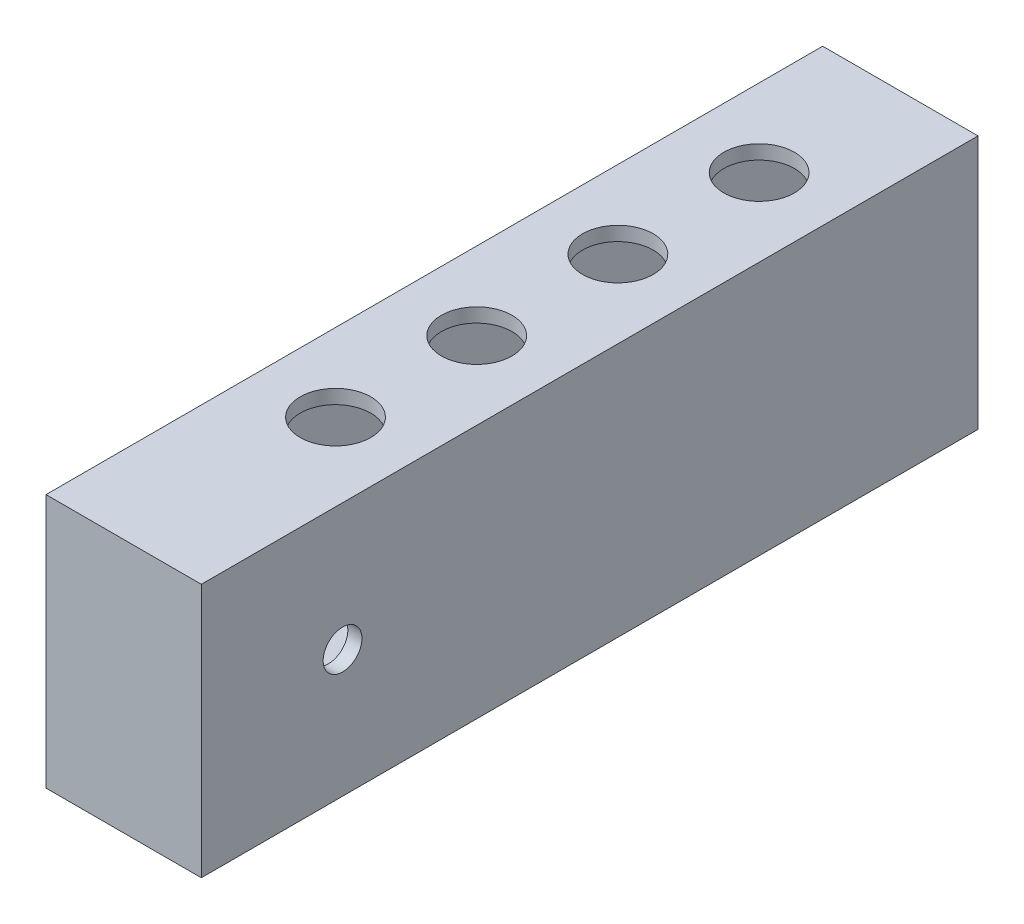
ISO-10303-21;
HEADER;
FILE_DESCRIPTION(('STEP AP214'),'2;1');
FILE_NAME('part.step','',(''),(''),'','','');
FILE_SCHEMA(('AUTOMOTIVE_DESIGN { 1 0 10303 214 1 1 1 1 }'));
ENDSEC;
DATA;
#1=APPLICATION_CONTEXT('core data for automotive mechanical design processes');
#2=APPLICATION_PROTOCOL_DEFINITION('international standard','automotive_design',2000,#1);
#3=PRODUCT_CONTEXT('',#1,'mechanical');
#4=PRODUCT('Part','Part','',(#3));
#5=PRODUCT_RELATED_PRODUCT_CATEGORY('part','',(#4));
#6=PRODUCT_DEFINITION_FORMATION('','',#4);
#7=PRODUCT_DEFINITION_CONTEXT('part definition',#1,'design');
#8=PRODUCT_DEFINITION('design','',#6,#7);
#9=PRODUCT_DEFINITION_SHAPE('','',#8);
#10=(LENGTH_UNIT() NAMED_UNIT(*) SI_UNIT(.MILLI.,.METRE.));
#11=(NAMED_UNIT(*) PLANE_ANGLE_UNIT() SI_UNIT($,.RADIAN.));
#12=(NAMED_UNIT(*) SI_UNIT($,.STERADIAN.) SOLID_ANGLE_UNIT());
#13=UNCERTAINTY_MEASURE_WITH_UNIT(LENGTH_MEASURE(1.E-05),#10,'distance_accuracy_value','');
#14=(GEOMETRIC_REPRESENTATION_CONTEXT(3) GLOBAL_UNCERTAINTY_ASSIGNED_CONTEXT((#13)) GLOBAL_UNIT_ASSIGNED_CONTEXT((#10,
#11,#12)) REPRESENTATION_CONTEXT('',''));
#15=CARTESIAN_POINT('',(0.,0.,0.));
#16=DIRECTION('',(0.,0.,1.));
#17=DIRECTION('',(1.,0.,0.));
#18=AXIS2_PLACEMENT_3D('',#15,#16,#17);
#19=CARTESIAN_POINT('',(0.,0.,110.));
#20=DIRECTION('',(0.,1.,0.));
#21=DIRECTION('',(0.,0.,1.));
#22=AXIS2_PLACEMENT_3D('',#19,#20,#21);
#23=PLANE('',#22);
#24=CARTESIAN_POINT('',(0.,0.,20.));
#25=DIRECTION('',(0.,-1.,0.));
#26=DIRECTION('',(0.,0.,-1.));
#27=AXIS2_PLACEMENT_3D('',#24,#25,#26);
#28=CIRCLE('',#27,5.);
#29=CARTESIAN_POINT('',(0.,0.,15.));
#30=VERTEX_POINT('',#29);
#31=EDGE_CURVE('E323',#30,#30,#28,.T.);
#32=ORIENTED_EDGE('',*,*,#31,.F.);
#33=EDGE_LOOP('',(#32));
#34=FACE_BOUND('',#33,.T.);
#35=CARTESIAN_POINT('',(-6.27241994192617E-13,0.,80.));
#36=DIRECTION('',(0.,-1.,0.));
#37=DIRECTION('',(0.,0.,-1.));
#38=AXIS2_PLACEMENT_3D('',#35,#36,#37);
#39=CIRCLE('',#38,5.);
#40=CARTESIAN_POINT('',(-6.27241994192617E-13,0.,75.));
#41=VERTEX_POINT('',#40);
#42=EDGE_CURVE('E325',#41,#41,#39,.T.);
#43=ORIENTED_EDGE('',*,*,#42,.F.);
#44=EDGE_LOOP('',(#43));
#45=FACE_BOUND('',#44,.T.);
#46=CARTESIAN_POINT('',(-4.18977760661176E-13,0.,60.));
#47=DIRECTION('',(0.,-1.,0.));
#48=DIRECTION('',(0.,0.,-1.));
#49=AXIS2_PLACEMENT_3D('',#46,#47,#48);
#50=CIRCLE('',#49,5.);
#51=CARTESIAN_POINT('',(-4.18977760661176E-13,0.,55.));
#52=VERTEX_POINT('',#51);
#53=EDGE_CURVE('E329',#52,#52,#50,.T.);
#54=ORIENTED_EDGE('',*,*,#53,.F.);
#55=EDGE_LOOP('',(#54));
#56=FACE_BOUND('',#55,.T.);
#57=CARTESIAN_POINT('',(-2.10713527129735E-13,0.,40.));
#58=DIRECTION('',(0.,-1.,0.));
#59=DIRECTION('',(0.,0.,-1.));
#60=AXIS2_PLACEMENT_3D('',#57,#58,#59);
#61=CIRCLE('',#60,5.);
#62=CARTESIAN_POINT('',(-2.10713527129735E-13,0.,35.));
#63=VERTEX_POINT('',#62);
#64=EDGE_CURVE('E204',#63,#63,#61,.T.);
#65=ORIENTED_EDGE('',*,*,#64,.F.);
#66=EDGE_LOOP('',(#65));
#67=FACE_BOUND('',#66,.T.);
#68=DIRECTION('',(1.,0.,0.));
#69=VECTOR('',#68,1.);
#70=CARTESIAN_POINT('',(0.,0.,0.));
#71=LINE('',#70,#69);
#72=CARTESIAN_POINT('',(-11.,0.,0.));
#73=VERTEX_POINT('',#72);
#74=CARTESIAN_POINT('',(11.,0.,0.));
#75=VERTEX_POINT('',#74);
#76=EDGE_CURVE('E167',#73,#75,#71,.T.);
#77=ORIENTED_EDGE('',*,*,#76,.T.);
#78=DIRECTION('',(0.,0.,-1.));
#79=VECTOR('',#78,1.);
#80=CARTESIAN_POINT('',(11.,0.,110.));
#81=LINE('',#80,#79);
#82=CARTESIAN_POINT('',(11.,0.,110.));
#83=VERTEX_POINT('',#82);
#84=EDGE_CURVE('E73',#83,#75,#81,.T.);
#85=ORIENTED_EDGE('',*,*,#84,.F.);
#86=DIRECTION('',(1.,0.,0.));
#87=VECTOR('',#86,1.);
#88=CARTESIAN_POINT('',(0.,0.,110.));
#89=LINE('',#88,#87);
#90=CARTESIAN_POINT('',(-11.,0.,110.));
#91=VERTEX_POINT('',#90);
#92=EDGE_CURVE('E118',#91,#83,#89,.T.);
#93=ORIENTED_EDGE('',*,*,#92,.F.);
#94=DIRECTION('',(0.,0.,-1.));
#95=VECTOR('',#94,1.);
#96=CARTESIAN_POINT('',(-11.,0.,110.));
#97=LINE('',#96,#95);
#98=EDGE_CURVE('E12',#91,#73,#97,.T.);
#99=ORIENTED_EDGE('',*,*,#98,.T.);
#100=EDGE_LOOP('',(#77,#85,#93,#99));
#101=FACE_BOUND('',#100,.T.);
#102=ADVANCED_FACE('F64',(#34,#45,#56,#67,#101),#23,.F.);
#103=CARTESIAN_POINT('',(11.,0.,110.));
#104=DIRECTION('',(-1.,0.,0.));
#105=DIRECTION('',(0.,-1.,0.));
#106=AXIS2_PLACEMENT_3D('',#103,#104,#105);
#107=PLANE('',#106);
#108=CARTESIAN_POINT('',(11.,18.,90.));
#109=DIRECTION('',(1.,0.,0.));
#110=DIRECTION('',(0.,1.,0.));
#111=AXIS2_PLACEMENT_3D('',#108,#109,#110);
#112=CIRCLE('',#111,2.75000000000001);
#113=CARTESIAN_POINT('',(11.,20.75,90.));
#114=VERTEX_POINT('',#113);
#115=EDGE_CURVE('E339',#114,#114,#112,.T.);
#116=ORIENTED_EDGE('',*,*,#115,.F.);
#117=EDGE_LOOP('',(#116));
#118=FACE_BOUND('',#117,.T.);
#119=DIRECTION('',(0.,1.,0.));
#120=VECTOR('',#119,1.);
#121=CARTESIAN_POINT('',(11.,0.,0.));
#122=LINE('',#121,#120);
#123=CARTESIAN_POINT('',(11.,36.,0.));
#124=VERTEX_POINT('',#123);
#125=EDGE_CURVE('E192',#75,#124,#122,.T.);
#126=ORIENTED_EDGE('',*,*,#125,.T.);
#127=DIRECTION('',(0.,0.,-1.));
#128=VECTOR('',#127,1.);
#129=CARTESIAN_POINT('',(11.,36.,110.));
#130=LINE('',#129,#128);
#131=CARTESIAN_POINT('',(11.,36.,110.));
#132=VERTEX_POINT('',#131);
#133=EDGE_CURVE('E196',#132,#124,#130,.T.);
#134=ORIENTED_EDGE('',*,*,#133,.F.);
#135=DIRECTION('',(0.,1.,0.));
#136=VECTOR('',#135,1.);
#137=CARTESIAN_POINT('',(11.,0.,110.));
#138=LINE('',#137,#136);
#139=EDGE_CURVE('E187',#83,#132,#138,.T.);
#140=ORIENTED_EDGE('',*,*,#139,.F.);
#141=ORIENTED_EDGE('',*,*,#84,.T.);
#142=EDGE_LOOP('',(#126,#134,#140,#141));
#143=FACE_BOUND('',#142,.T.);
#144=ADVANCED_FACE('F258',(#118,#143),#107,.F.);
#145=CARTESIAN_POINT('',(0.,36.,110.));
#146=DIRECTION('',(0.,-1.,0.));
#147=DIRECTION('',(0.,0.,-1.));
#148=AXIS2_PLACEMENT_3D('',#145,#146,#147);
#149=PLANE('',#148);
#150=CARTESIAN_POINT('',(0.,36.,20.));
#151=DIRECTION('',(0.,-1.,0.));
#152=DIRECTION('',(0.,0.,-1.));
#153=AXIS2_PLACEMENT_3D('',#150,#151,#152);
#154=CIRCLE('',#153,5.);
#155=CARTESIAN_POINT('',(0.,36.,15.));
#156=VERTEX_POINT('',#155);
#157=EDGE_CURVE('E180',#156,#156,#154,.T.);
#158=ORIENTED_EDGE('',*,*,#157,.T.);
#159=EDGE_LOOP('',(#158));
#160=FACE_BOUND('',#159,.T.);
#161=CARTESIAN_POINT('',(-6.27241994192617E-13,36.,80.));
#162=DIRECTION('',(0.,-1.,0.));
#163=DIRECTION('',(0.,0.,-1.));
#164=AXIS2_PLACEMENT_3D('',#161,#162,#163);
#165=CIRCLE('',#164,5.);
#166=CARTESIAN_POINT('',(-6.27241994192617E-13,36.,75.));
#167=VERTEX_POINT('',#166);
#168=EDGE_CURVE('E217',#167,#167,#165,.T.);
#169=ORIENTED_EDGE('',*,*,#168,.T.);
#170=EDGE_LOOP('',(#169));
#171=FACE_BOUND('',#170,.T.);
#172=CARTESIAN_POINT('',(-4.18977760661176E-13,36.,60.));
#173=DIRECTION('',(0.,-1.,0.));
#174=DIRECTION('',(0.,0.,-1.));
#175=AXIS2_PLACEMENT_3D('',#172,#173,#174);
#176=CIRCLE('',#175,5.);
#177=CARTESIAN_POINT('',(-4.18977760661176E-13,36.,55.));
#178=VERTEX_POINT('',#177);
#179=EDGE_CURVE('E213',#178,#178,#176,.T.);
#180=ORIENTED_EDGE('',*,*,#179,.T.);
#181=EDGE_LOOP('',(#180));
#182=FACE_BOUND('',#181,.T.);
#183=CARTESIAN_POINT('',(-2.10713527129735E-13,36.,40.));
#184=DIRECTION('',(0.,-1.,0.));
#185=DIRECTION('',(0.,0.,-1.));
#186=AXIS2_PLACEMENT_3D('',#183,#184,#185);
#187=CIRCLE('',#186,5.);
#188=CARTESIAN_POINT('',(-2.10713527129735E-13,36.,35.));
#189=VERTEX_POINT('',#188);
#190=EDGE_CURVE('E209',#189,#189,#187,.T.);
#191=ORIENTED_EDGE('',*,*,#190,.T.);
#192=EDGE_LOOP('',(#191));
#193=FACE_BOUND('',#192,.T.);
#194=DIRECTION('',(-1.,0.,0.));
#195=VECTOR('',#194,1.);
#196=CARTESIAN_POINT('',(0.,36.,0.));
#197=LINE('',#196,#195);
#198=CARTESIAN_POINT('',(-11.,36.,0.));
#199=VERTEX_POINT('',#198);
#200=EDGE_CURVE('E111',#124,#199,#197,.T.);
#201=ORIENTED_EDGE('',*,*,#200,.T.);
#202=DIRECTION('',(0.,0.,-1.));
#203=VECTOR('',#202,1.);
#204=CARTESIAN_POINT('',(-11.,36.,110.));
#205=LINE('',#204,#203);
#206=CARTESIAN_POINT('',(-11.,36.,110.));
#207=VERTEX_POINT('',#206);
#208=EDGE_CURVE('E189',#207,#199,#205,.T.);
#209=ORIENTED_EDGE('',*,*,#208,.F.);
#210=DIRECTION('',(-1.,0.,0.));
#211=VECTOR('',#210,1.);
#212=CARTESIAN_POINT('',(0.,36.,110.));
#213=LINE('',#212,#211);
#214=EDGE_CURVE('E90',#132,#207,#213,.T.);
#215=ORIENTED_EDGE('',*,*,#214,.F.);
#216=ORIENTED_EDGE('',*,*,#133,.T.);
#217=EDGE_LOOP('',(#201,#209,#215,#216));
#218=FACE_BOUND('',#217,.T.);
#219=ADVANCED_FACE('F233',(#160,#171,#182,#193,#218),#149,.F.);
#220=CARTESIAN_POINT('',(-11.,0.,110.));
#221=DIRECTION('',(1.,0.,0.));
#222=DIRECTION('',(0.,1.,0.));
#223=AXIS2_PLACEMENT_3D('',#220,#221,#222);
#224=PLANE('',#223);
#225=CARTESIAN_POINT('',(-11.,18.,90.));
#226=DIRECTION('',(1.,0.,0.));
#227=DIRECTION('',(0.,1.,0.));
#228=AXIS2_PLACEMENT_3D('',#225,#226,#227);
#229=CIRCLE('',#228,2.75000000000001);
#230=CARTESIAN_POINT('',(-11.,20.75,90.));
#231=VERTEX_POINT('',#230);
#232=EDGE_CURVE('E333',#231,#231,#229,.T.);
#233=ORIENTED_EDGE('',*,*,#232,.T.);
#234=EDGE_LOOP('',(#233));
#235=FACE_BOUND('',#234,.T.);
#236=DIRECTION('',(0.,-1.,0.));
#237=VECTOR('',#236,1.);
#238=CARTESIAN_POINT('',(-11.,0.,0.));
#239=LINE('',#238,#237);
#240=EDGE_CURVE('E163',#199,#73,#239,.T.);
#241=ORIENTED_EDGE('',*,*,#240,.T.);
#242=ORIENTED_EDGE('',*,*,#98,.F.);
#243=DIRECTION('',(0.,-1.,0.));
#244=VECTOR('',#243,1.);
#245=CARTESIAN_POINT('',(-11.,0.,110.));
#246=LINE('',#245,#244);
#247=EDGE_CURVE('E184',#207,#91,#246,.T.);
#248=ORIENTED_EDGE('',*,*,#247,.F.);
#249=ORIENTED_EDGE('',*,*,#208,.T.);
#250=EDGE_LOOP('',(#241,#242,#248,#249));
#251=FACE_BOUND('',#250,.T.);
#252=ADVANCED_FACE('F66',(#235,#251),#224,.F.);
#253=CARTESIAN_POINT('',(0.,0.,0.));
#254=DIRECTION('',(0.,0.,1.));
#255=DIRECTION('',(1.,0.,0.));
#256=AXIS2_PLACEMENT_3D('',#253,#254,#255);
#257=PLANE('',#256);
#258=DIRECTION('',(-1.,0.,0.));
#259=VECTOR('',#258,1.);
#260=CARTESIAN_POINT('',(0.,34.,0.));
#261=LINE('',#260,#259);
#262=CARTESIAN_POINT('',(9.,34.,0.));
#263=VERTEX_POINT('',#262);
#264=CARTESIAN_POINT('',(-9.,34.,0.));
#265=VERTEX_POINT('',#264);
#266=EDGE_CURVE('E158',#263,#265,#261,.T.);
#267=ORIENTED_EDGE('',*,*,#266,.T.);
#268=DIRECTION('',(0.,-1.,0.));
#269=VECTOR('',#268,1.);
#270=CARTESIAN_POINT('',(-9.,0.,0.));
#271=LINE('',#270,#269);
#272=CARTESIAN_POINT('',(-9.,2.,0.));
#273=VERTEX_POINT('',#272);
#274=EDGE_CURVE('E178',#265,#273,#271,.T.);
#275=ORIENTED_EDGE('',*,*,#274,.T.);
#276=DIRECTION('',(1.,0.,0.));
#277=VECTOR('',#276,1.);
#278=CARTESIAN_POINT('',(0.,2.,0.));
#279=LINE('',#278,#277);
#280=CARTESIAN_POINT('',(9.,2.,0.));
#281=VERTEX_POINT('',#280);
#282=EDGE_CURVE('E162',#273,#281,#279,.T.);
#283=ORIENTED_EDGE('',*,*,#282,.T.);
#284=DIRECTION('',(0.,1.,0.));
#285=VECTOR('',#284,1.);
#286=CARTESIAN_POINT('',(9.,0.,0.));
#287=LINE('',#286,#285);
#288=EDGE_CURVE('E81',#281,#263,#287,.T.);
#289=ORIENTED_EDGE('',*,*,#288,.T.);
#290=EDGE_LOOP('',(#267,#275,#283,#289));
#291=FACE_BOUND('',#290,.T.);
#292=ORIENTED_EDGE('',*,*,#240,.F.);
#293=ORIENTED_EDGE('',*,*,#200,.F.);
#294=ORIENTED_EDGE('',*,*,#125,.F.);
#295=ORIENTED_EDGE('',*,*,#76,.F.);
#296=EDGE_LOOP('',(#292,#293,#294,#295));
#297=FACE_BOUND('',#296,.T.);
#298=ADVANCED_FACE('F270',(#291,#297),#257,.F.);
#299=CARTESIAN_POINT('',(0.,0.,110.));
#300=DIRECTION('',(0.,0.,1.));
#301=DIRECTION('',(1.,0.,0.));
#302=AXIS2_PLACEMENT_3D('',#299,#300,#301);
#303=PLANE('',#302);
#304=ORIENTED_EDGE('',*,*,#247,.T.);
#305=ORIENTED_EDGE('',*,*,#92,.T.);
#306=ORIENTED_EDGE('',*,*,#139,.T.);
#307=ORIENTED_EDGE('',*,*,#214,.T.);
#308=EDGE_LOOP('',(#304,#305,#306,#307));
#309=FACE_BOUND('',#308,.T.);
#310=ADVANCED_FACE('F273',(#309),#303,.T.);
#311=CARTESIAN_POINT('',(0.,2.,110.));
#312=DIRECTION('',(0.,1.,0.));
#313=DIRECTION('',(0.,0.,1.));
#314=AXIS2_PLACEMENT_3D('',#311,#312,#313);
#315=PLANE('',#314);
#316=CARTESIAN_POINT('',(0.,2.,20.));
#317=DIRECTION('',(0.,1.,0.));
#318=DIRECTION('',(0.,0.,1.));
#319=AXIS2_PLACEMENT_3D('',#316,#317,#318);
#320=CIRCLE('',#319,5.);
#321=CARTESIAN_POINT('',(0.,2.,25.));
#322=VERTEX_POINT('',#321);
#323=EDGE_CURVE('E216',#322,#322,#320,.T.);
#324=ORIENTED_EDGE('',*,*,#323,.F.);
#325=EDGE_LOOP('',(#324));
#326=FACE_BOUND('',#325,.T.);
#327=CARTESIAN_POINT('',(-6.27241994192617E-13,2.,80.));
#328=DIRECTION('',(0.,1.,0.));
#329=DIRECTION('',(0.,0.,1.));
#330=AXIS2_PLACEMENT_3D('',#327,#328,#329);
#331=CIRCLE('',#330,5.);
#332=CARTESIAN_POINT('',(-6.27241994192617E-13,2.,85.));
#333=VERTEX_POINT('',#332);
#334=EDGE_CURVE('E212',#333,#333,#331,.T.);
#335=ORIENTED_EDGE('',*,*,#334,.F.);
#336=EDGE_LOOP('',(#335));
#337=FACE_BOUND('',#336,.T.);
#338=CARTESIAN_POINT('',(-4.18977760661176E-13,2.,60.));
#339=DIRECTION('',(0.,1.,0.));
#340=DIRECTION('',(0.,0.,1.));
#341=AXIS2_PLACEMENT_3D('',#338,#339,#340);
#342=CIRCLE('',#341,5.);
#343=CARTESIAN_POINT('',(-4.18977760661176E-13,2.,65.));
#344=VERTEX_POINT('',#343);
#345=EDGE_CURVE('E208',#344,#344,#342,.T.);
#346=ORIENTED_EDGE('',*,*,#345,.F.);
#347=EDGE_LOOP('',(#346));
#348=FACE_BOUND('',#347,.T.);
#349=CARTESIAN_POINT('',(-2.10713527129735E-13,2.,40.));
#350=DIRECTION('',(0.,1.,0.));
#351=DIRECTION('',(0.,0.,1.));
#352=AXIS2_PLACEMENT_3D('',#349,#350,#351);
#353=CIRCLE('',#352,5.);
#354=CARTESIAN_POINT('',(-2.10713527129735E-13,2.,45.));
#355=VERTEX_POINT('',#354);
#356=EDGE_CURVE('E203',#355,#355,#353,.T.);
#357=ORIENTED_EDGE('',*,*,#356,.F.);
#358=EDGE_LOOP('',(#357));
#359=FACE_BOUND('',#358,.T.);
#360=ORIENTED_EDGE('',*,*,#282,.F.);
#361=DIRECTION('',(0.,0.,-1.));
#362=VECTOR('',#361,1.);
#363=CARTESIAN_POINT('',(-9.,2.,110.));
#364=LINE('',#363,#362);
#365=CARTESIAN_POINT('',(-9.,2.,108.));
#366=VERTEX_POINT('',#365);
#367=EDGE_CURVE('E155',#366,#273,#364,.T.);
#368=ORIENTED_EDGE('',*,*,#367,.F.);
#369=DIRECTION('',(1.,0.,0.));
#370=VECTOR('',#369,1.);
#371=CARTESIAN_POINT('',(0.,2.,108.));
#372=LINE('',#371,#370);
#373=CARTESIAN_POINT('',(9.,2.,108.));
#374=VERTEX_POINT('',#373);
#375=EDGE_CURVE('E141',#366,#374,#372,.T.);
#376=ORIENTED_EDGE('',*,*,#375,.T.);
#377=DIRECTION('',(0.,0.,-1.));
#378=VECTOR('',#377,1.);
#379=CARTESIAN_POINT('',(9.,2.,110.));
#380=LINE('',#379,#378);
#381=EDGE_CURVE('E164',#374,#281,#380,.T.);
#382=ORIENTED_EDGE('',*,*,#381,.T.);
#383=EDGE_LOOP('',(#360,#368,#376,#382));
#384=FACE_BOUND('',#383,.T.);
#385=ADVANCED_FACE('F160',(#326,#337,#348,#359,#384),#315,.T.);
#386=CARTESIAN_POINT('',(9.,0.,110.));
#387=DIRECTION('',(-1.,0.,0.));
#388=DIRECTION('',(0.,-1.,0.));
#389=AXIS2_PLACEMENT_3D('',#386,#387,#388);
#390=PLANE('',#389);
#391=CARTESIAN_POINT('',(9.,18.,90.));
#392=DIRECTION('',(-1.,0.,0.));
#393=DIRECTION('',(0.,-1.,0.));
#394=AXIS2_PLACEMENT_3D('',#391,#392,#393);
#395=CIRCLE('',#394,2.75000000000001);
#396=CARTESIAN_POINT('',(9.,15.25,90.));
#397=VERTEX_POINT('',#396);
#398=EDGE_CURVE('E336',#397,#397,#395,.T.);
#399=ORIENTED_EDGE('',*,*,#398,.F.);
#400=EDGE_LOOP('',(#399));
#401=FACE_BOUND('',#400,.T.);
#402=ORIENTED_EDGE('',*,*,#288,.F.);
#403=ORIENTED_EDGE('',*,*,#381,.F.);
#404=DIRECTION('',(0.,1.,0.));
#405=VECTOR('',#404,1.);
#406=CARTESIAN_POINT('',(9.,0.,108.));
#407=LINE('',#406,#405);
#408=CARTESIAN_POINT('',(9.,34.,108.));
#409=VERTEX_POINT('',#408);
#410=EDGE_CURVE('E146',#374,#409,#407,.T.);
#411=ORIENTED_EDGE('',*,*,#410,.T.);
#412=DIRECTION('',(0.,0.,-1.));
#413=VECTOR('',#412,1.);
#414=CARTESIAN_POINT('',(9.,34.,110.));
#415=LINE('',#414,#413);
#416=EDGE_CURVE('E169',#409,#263,#415,.T.);
#417=ORIENTED_EDGE('',*,*,#416,.T.);
#418=EDGE_LOOP('',(#402,#403,#411,#417));
#419=FACE_BOUND('',#418,.T.);
#420=ADVANCED_FACE('F285',(#401,#419),#390,.T.);
#421=CARTESIAN_POINT('',(0.,34.,110.));
#422=DIRECTION('',(0.,-1.,0.));
#423=DIRECTION('',(0.,0.,-1.));
#424=AXIS2_PLACEMENT_3D('',#421,#422,#423);
#425=PLANE('',#424);
#426=CARTESIAN_POINT('',(0.,34.,20.));
#427=DIRECTION('',(0.,-1.,0.));
#428=DIRECTION('',(0.,0.,-1.));
#429=AXIS2_PLACEMENT_3D('',#426,#427,#428);
#430=CIRCLE('',#429,5.);
#431=CARTESIAN_POINT('',(0.,34.,15.));
#432=VERTEX_POINT('',#431);
#433=EDGE_CURVE('E214',#432,#432,#430,.T.);
#434=ORIENTED_EDGE('',*,*,#433,.F.);
#435=EDGE_LOOP('',(#434));
#436=FACE_BOUND('',#435,.T.);
#437=CARTESIAN_POINT('',(-6.27241994192617E-13,34.,80.));
#438=DIRECTION('',(0.,-1.,0.));
#439=DIRECTION('',(0.,0.,-1.));
#440=AXIS2_PLACEMENT_3D('',#437,#438,#439);
#441=CIRCLE('',#440,5.);
#442=CARTESIAN_POINT('',(-6.27241994192617E-13,34.,75.));
#443=VERTEX_POINT('',#442);
#444=EDGE_CURVE('E210',#443,#443,#441,.T.);
#445=ORIENTED_EDGE('',*,*,#444,.F.);
#446=EDGE_LOOP('',(#445));
#447=FACE_BOUND('',#446,.T.);
#448=CARTESIAN_POINT('',(-4.18977760661176E-13,34.,60.));
#449=DIRECTION('',(0.,-1.,0.));
#450=DIRECTION('',(0.,0.,-1.));
#451=AXIS2_PLACEMENT_3D('',#448,#449,#450);
#452=CIRCLE('',#451,5.);
#453=CARTESIAN_POINT('',(-4.18977760661176E-13,34.,55.));
#454=VERTEX_POINT('',#453);
#455=EDGE_CURVE('E205',#454,#454,#452,.T.);
#456=ORIENTED_EDGE('',*,*,#455,.F.);
#457=EDGE_LOOP('',(#456));
#458=FACE_BOUND('',#457,.T.);
#459=CARTESIAN_POINT('',(-2.10713527129735E-13,34.,40.));
#460=DIRECTION('',(0.,-1.,0.));
#461=DIRECTION('',(0.,0.,-1.));
#462=AXIS2_PLACEMENT_3D('',#459,#460,#461);
#463=CIRCLE('',#462,5.);
#464=CARTESIAN_POINT('',(-2.10713527129735E-13,34.,35.));
#465=VERTEX_POINT('',#464);
#466=EDGE_CURVE('E200',#465,#465,#463,.T.);
#467=ORIENTED_EDGE('',*,*,#466,.F.);
#468=EDGE_LOOP('',(#467));
#469=FACE_BOUND('',#468,.T.);
#470=ORIENTED_EDGE('',*,*,#266,.F.);
#471=ORIENTED_EDGE('',*,*,#416,.F.);
#472=DIRECTION('',(-1.,0.,0.));
#473=VECTOR('',#472,1.);
#474=CARTESIAN_POINT('',(0.,34.,108.));
#475=LINE('',#474,#473);
#476=CARTESIAN_POINT('',(-9.,34.,108.));
#477=VERTEX_POINT('',#476);
#478=EDGE_CURVE('E174',#409,#477,#475,.T.);
#479=ORIENTED_EDGE('',*,*,#478,.T.);
#480=DIRECTION('',(0.,0.,-1.));
#481=VECTOR('',#480,1.);
#482=CARTESIAN_POINT('',(-9.,34.,110.));
#483=LINE('',#482,#481);
#484=EDGE_CURVE('E157',#477,#265,#483,.T.);
#485=ORIENTED_EDGE('',*,*,#484,.T.);
#486=EDGE_LOOP('',(#470,#471,#479,#485));
#487=FACE_BOUND('',#486,.T.);
#488=ADVANCED_FACE('F281',(#436,#447,#458,#469,#487),#425,.T.);
#489=CARTESIAN_POINT('',(-9.,0.,110.));
#490=DIRECTION('',(1.,0.,0.));
#491=DIRECTION('',(0.,1.,0.));
#492=AXIS2_PLACEMENT_3D('',#489,#490,#491);
#493=PLANE('',#492);
#494=CARTESIAN_POINT('',(-9.,18.,90.));
#495=DIRECTION('',(1.,0.,0.));
#496=DIRECTION('',(0.,1.,0.));
#497=AXIS2_PLACEMENT_3D('',#494,#495,#496);
#498=CIRCLE('',#497,2.75000000000001);
#499=CARTESIAN_POINT('',(-9.,20.75,90.));
#500=VERTEX_POINT('',#499);
#501=EDGE_CURVE('E68',#500,#500,#498,.T.);
#502=ORIENTED_EDGE('',*,*,#501,.F.);
#503=EDGE_LOOP('',(#502));
#504=FACE_BOUND('',#503,.T.);
#505=ORIENTED_EDGE('',*,*,#274,.F.);
#506=ORIENTED_EDGE('',*,*,#484,.F.);
#507=DIRECTION('',(0.,-1.,0.));
#508=VECTOR('',#507,1.);
#509=CARTESIAN_POINT('',(-9.,0.,108.));
#510=LINE('',#509,#508);
#511=EDGE_CURVE('E145',#477,#366,#510,.T.);
#512=ORIENTED_EDGE('',*,*,#511,.T.);
#513=ORIENTED_EDGE('',*,*,#367,.T.);
#514=EDGE_LOOP('',(#505,#506,#512,#513));
#515=FACE_BOUND('',#514,.T.);
#516=ADVANCED_FACE('F154',(#504,#515),#493,.T.);
#517=CARTESIAN_POINT('',(0.,0.,108.));
#518=DIRECTION('',(0.,0.,1.));
#519=DIRECTION('',(1.,0.,0.));
#520=AXIS2_PLACEMENT_3D('',#517,#518,#519);
#521=PLANE('',#520);
#522=ORIENTED_EDGE('',*,*,#511,.F.);
#523=ORIENTED_EDGE('',*,*,#478,.F.);
#524=ORIENTED_EDGE('',*,*,#410,.F.);
#525=ORIENTED_EDGE('',*,*,#375,.F.);
#526=EDGE_LOOP('',(#522,#523,#524,#525));
#527=FACE_BOUND('',#526,.T.);
#528=ADVANCED_FACE('F143',(#527),#521,.F.);
#529=CARTESIAN_POINT('',(-2.10713527129735E-13,1000.,40.));
#530=DIRECTION('',(0.,-1.,0.));
#531=DIRECTION('',(0.,0.,-1.));
#532=AXIS2_PLACEMENT_3D('',#529,#530,#531);
#533=CYLINDRICAL_SURFACE('',#532,5.);
#534=ORIENTED_EDGE('',*,*,#466,.T.);
#535=EDGE_LOOP('',(#534));
#536=FACE_BOUND('',#535,.T.);
#537=ORIENTED_EDGE('',*,*,#190,.F.);
#538=EDGE_LOOP('',(#537));
#539=FACE_BOUND('',#538,.T.);
#540=ADVANCED_FACE('F248',(#536,#539),#533,.F.);
#541=CARTESIAN_POINT('',(-4.18977760661176E-13,1000.,60.));
#542=DIRECTION('',(0.,-1.,0.));
#543=DIRECTION('',(0.,0.,-1.));
#544=AXIS2_PLACEMENT_3D('',#541,#542,#543);
#545=CYLINDRICAL_SURFACE('',#544,5.);
#546=ORIENTED_EDGE('',*,*,#455,.T.);
#547=EDGE_LOOP('',(#546));
#548=FACE_BOUND('',#547,.T.);
#549=ORIENTED_EDGE('',*,*,#179,.F.);
#550=EDGE_LOOP('',(#549));
#551=FACE_BOUND('',#550,.T.);
#552=ADVANCED_FACE('F249',(#548,#551),#545,.F.);
#553=CARTESIAN_POINT('',(-6.27241994192617E-13,1000.,80.));
#554=DIRECTION('',(0.,-1.,0.));
#555=DIRECTION('',(0.,0.,-1.));
#556=AXIS2_PLACEMENT_3D('',#553,#554,#555);
#557=CYLINDRICAL_SURFACE('',#556,5.);
#558=ORIENTED_EDGE('',*,*,#444,.T.);
#559=EDGE_LOOP('',(#558));
#560=FACE_BOUND('',#559,.T.);
#561=ORIENTED_EDGE('',*,*,#168,.F.);
#562=EDGE_LOOP('',(#561));
#563=FACE_BOUND('',#562,.T.);
#564=ADVANCED_FACE('F238',(#560,#563),#557,.F.);
#565=CARTESIAN_POINT('',(0.,1000.,20.));
#566=DIRECTION('',(0.,-1.,0.));
#567=DIRECTION('',(0.,0.,-1.));
#568=AXIS2_PLACEMENT_3D('',#565,#566,#567);
#569=CYLINDRICAL_SURFACE('',#568,5.);
#570=ORIENTED_EDGE('',*,*,#433,.T.);
#571=EDGE_LOOP('',(#570));
#572=FACE_BOUND('',#571,.T.);
#573=ORIENTED_EDGE('',*,*,#157,.F.);
#574=EDGE_LOOP('',(#573));
#575=FACE_BOUND('',#574,.T.);
#576=ADVANCED_FACE('F235',(#572,#575),#569,.F.);
#577=ORIENTED_EDGE('',*,*,#356,.T.);
#578=EDGE_LOOP('',(#577));
#579=FACE_BOUND('',#578,.T.);
#580=ORIENTED_EDGE('',*,*,#64,.T.);
#581=EDGE_LOOP('',(#580));
#582=FACE_BOUND('',#581,.T.);
#583=ADVANCED_FACE('F237',(#579,#582),#533,.F.);
#584=ORIENTED_EDGE('',*,*,#345,.T.);
#585=EDGE_LOOP('',(#584));
#586=FACE_BOUND('',#585,.T.);
#587=ORIENTED_EDGE('',*,*,#53,.T.);
#588=EDGE_LOOP('',(#587));
#589=FACE_BOUND('',#588,.T.);
#590=ADVANCED_FACE('F245',(#586,#589),#545,.F.);
#591=ORIENTED_EDGE('',*,*,#334,.T.);
#592=EDGE_LOOP('',(#591));
#593=FACE_BOUND('',#592,.T.);
#594=ORIENTED_EDGE('',*,*,#42,.T.);
#595=EDGE_LOOP('',(#594));
#596=FACE_BOUND('',#595,.T.);
#597=ADVANCED_FACE('F252',(#593,#596),#557,.F.);
#598=ORIENTED_EDGE('',*,*,#323,.T.);
#599=EDGE_LOOP('',(#598));
#600=FACE_BOUND('',#599,.T.);
#601=ORIENTED_EDGE('',*,*,#31,.T.);
#602=EDGE_LOOP('',(#601));
#603=FACE_BOUND('',#602,.T.);
#604=ADVANCED_FACE('F240',(#600,#603),#569,.F.);
#605=CARTESIAN_POINT('',(-18.,18.,90.));
#606=DIRECTION('',(1.,0.,0.));
#607=DIRECTION('',(0.,1.,0.));
#608=AXIS2_PLACEMENT_3D('',#605,#606,#607);
#609=CYLINDRICAL_SURFACE('',#608,2.75000000000001);
#610=ORIENTED_EDGE('',*,*,#501,.T.);
#611=EDGE_LOOP('',(#610));
#612=FACE_BOUND('',#611,.T.);
#613=ORIENTED_EDGE('',*,*,#232,.F.);
#614=EDGE_LOOP('',(#613));
#615=FACE_BOUND('',#614,.T.);
#616=ADVANCED_FACE('F255',(#612,#615),#609,.F.);
#617=ORIENTED_EDGE('',*,*,#398,.T.);
#618=EDGE_LOOP('',(#617));
#619=FACE_BOUND('',#618,.T.);
#620=ORIENTED_EDGE('',*,*,#115,.T.);
#621=EDGE_LOOP('',(#620));
#622=FACE_BOUND('',#621,.T.);
#623=ADVANCED_FACE('F348',(#619,#622),#609,.F.);
#624=CLOSED_SHELL('',(#102,#144,#219,#252,#298,#310,#385,#420,#488,#516,#528,#540,#552,#564,
#576,#583,#590,#597,#604,#616,#623));
#625=MANIFOLD_SOLID_BREP('B2',#624);
#626=ADVANCED_BREP_SHAPE_REPRESENTATION('',(#18,#625),#14);
#627=SHAPE_DEFINITION_REPRESENTATION(#9,#626);
ENDSEC;
END-ISO-10303-21;
